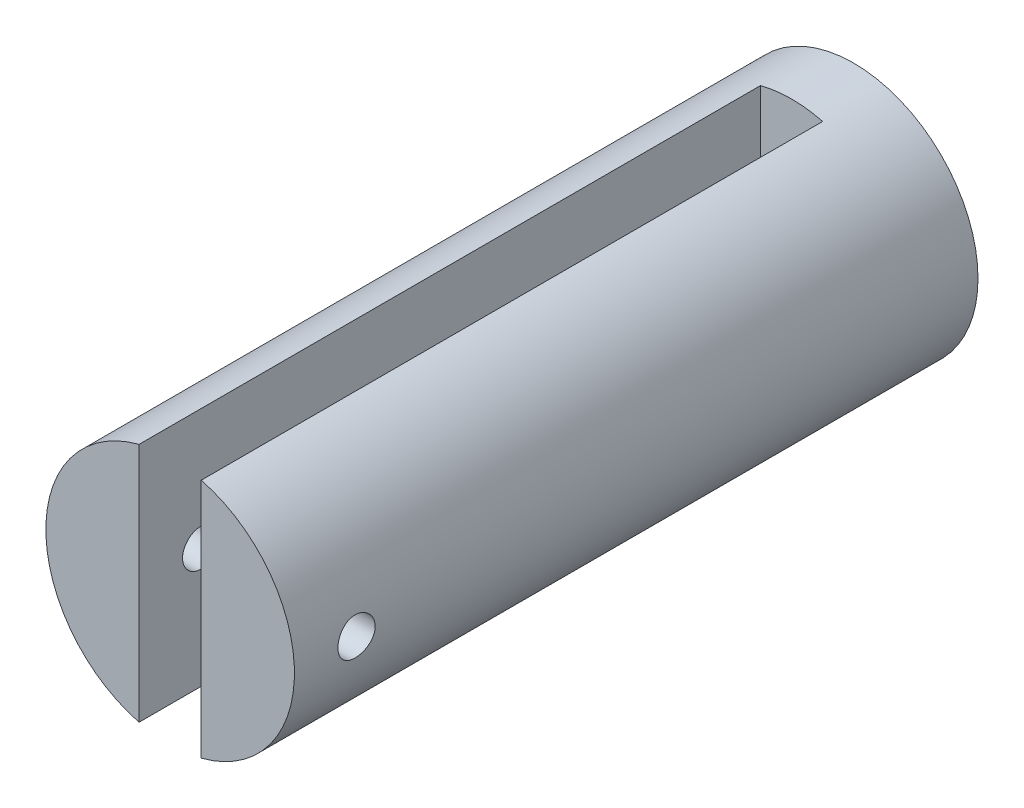
ISO-10303-21;
HEADER;
FILE_DESCRIPTION(('STEP AP214'),'2;1');
FILE_NAME('part.step','',(''),(''),'','','');
FILE_SCHEMA(('AUTOMOTIVE_DESIGN { 1 0 10303 214 1 1 1 1 }'));
ENDSEC;
DATA;
#1=APPLICATION_CONTEXT('core data for automotive mechanical design processes');
#2=APPLICATION_PROTOCOL_DEFINITION('international standard','automotive_design',2000,#1);
#3=PRODUCT_CONTEXT('',#1,'mechanical');
#4=PRODUCT('Part','Part','',(#3));
#5=PRODUCT_RELATED_PRODUCT_CATEGORY('part','',(#4));
#6=PRODUCT_DEFINITION_FORMATION('','',#4);
#7=PRODUCT_DEFINITION_CONTEXT('part definition',#1,'design');
#8=PRODUCT_DEFINITION('design','',#6,#7);
#9=PRODUCT_DEFINITION_SHAPE('','',#8);
#10=(LENGTH_UNIT() NAMED_UNIT(*) SI_UNIT(.MILLI.,.METRE.));
#11=(NAMED_UNIT(*) PLANE_ANGLE_UNIT() SI_UNIT($,.RADIAN.));
#12=(NAMED_UNIT(*) SI_UNIT($,.STERADIAN.) SOLID_ANGLE_UNIT());
#13=UNCERTAINTY_MEASURE_WITH_UNIT(LENGTH_MEASURE(1.E-05),#10,'distance_accuracy_value','');
#14=(GEOMETRIC_REPRESENTATION_CONTEXT(3) GLOBAL_UNCERTAINTY_ASSIGNED_CONTEXT((#13)) GLOBAL_UNIT_ASSIGNED_CONTEXT((#10,
#11,#12)) REPRESENTATION_CONTEXT('',''));
#15=CARTESIAN_POINT('',(0.,0.,0.));
#16=DIRECTION('',(0.,0.,1.));
#17=DIRECTION('',(1.,0.,0.));
#18=AXIS2_PLACEMENT_3D('',#15,#16,#17);
#19=CARTESIAN_POINT('',(0.,0.,5.));
#20=DIRECTION('',(0.,0.,-1.));
#21=DIRECTION('',(-1.,0.,0.));
#22=AXIS2_PLACEMENT_3D('',#19,#20,#21);
#23=CYLINDRICAL_SURFACE('',#22,2.5);
#24=CARTESIAN_POINT('',(0.,0.,0.));
#25=DIRECTION('',(0.,0.,1.));
#26=DIRECTION('',(1.,0.,0.));
#27=AXIS2_PLACEMENT_3D('',#24,#25,#26);
#28=CIRCLE('',#27,2.5);
#29=CARTESIAN_POINT('',(2.5,0.,0.));
#30=VERTEX_POINT('',#29);
#31=EDGE_CURVE('E188',#30,#30,#28,.T.);
#32=ORIENTED_EDGE('',*,*,#31,.F.);
#33=EDGE_LOOP('',(#32));
#34=FACE_BOUND('',#33,.T.);
#35=CARTESIAN_POINT('',(0.,0.,2.5));
#36=DIRECTION('',(0.,0.,1.));
#37=DIRECTION('',(1.,0.,0.));
#38=AXIS2_PLACEMENT_3D('',#35,#36,#37);
#39=CIRCLE('',#38,2.5);
#40=CARTESIAN_POINT('',(2.5,0.,2.5));
#41=VERTEX_POINT('',#40);
#42=EDGE_CURVE('E38',#41,#41,#39,.T.);
#43=ORIENTED_EDGE('',*,*,#42,.T.);
#44=EDGE_LOOP('',(#43));
#45=FACE_BOUND('',#44,.T.);
#46=ADVANCED_FACE('F33',(#34,#45),#23,.F.);
#47=CARTESIAN_POINT('',(0.,0.,5.));
#48=DIRECTION('',(0.,0.,1.));
#49=DIRECTION('',(1.,0.,0.));
#50=AXIS2_PLACEMENT_3D('',#47,#48,#49);
#51=PLANE('',#50);
#52=CARTESIAN_POINT('',(0.,0.,5.));
#53=DIRECTION('',(0.,0.,1.));
#54=DIRECTION('',(1.,0.,0.));
#55=AXIS2_PLACEMENT_3D('',#52,#53,#54);
#56=CIRCLE('',#55,3.75);
#57=CARTESIAN_POINT('',(2.5,2.79508497187474,5.));
#58=VERTEX_POINT('',#57);
#59=CARTESIAN_POINT('',(-2.5,2.79508497187474,5.));
#60=VERTEX_POINT('',#59);
#61=EDGE_CURVE('E110',#58,#60,#56,.T.);
#62=ORIENTED_EDGE('',*,*,#61,.F.);
#63=DIRECTION('',(0.,-1.,0.));
#64=VECTOR('',#63,1.);
#65=CARTESIAN_POINT('',(2.5,-9.68245836551855,5.));
#66=LINE('',#65,#64);
#67=CARTESIAN_POINT('',(2.5,9.68245836551854,5.));
#68=VERTEX_POINT('',#67);
#69=EDGE_CURVE('E123',#68,#58,#66,.T.);
#70=ORIENTED_EDGE('',*,*,#69,.F.);
#71=CARTESIAN_POINT('',(0.,0.,5.));
#72=DIRECTION('',(0.,0.,1.));
#73=DIRECTION('',(1.,0.,0.));
#74=AXIS2_PLACEMENT_3D('',#71,#72,#73);
#75=CIRCLE('',#74,10.);
#76=CARTESIAN_POINT('',(-2.5,9.68245836551854,5.));
#77=VERTEX_POINT('',#76);
#78=EDGE_CURVE('E199',#68,#77,#75,.T.);
#79=ORIENTED_EDGE('',*,*,#78,.T.);
#80=DIRECTION('',(0.,1.,0.));
#81=VECTOR('',#80,1.);
#82=CARTESIAN_POINT('',(-2.5,-9.68245836551854,5.));
#83=LINE('',#82,#81);
#84=EDGE_CURVE('E58',#60,#77,#83,.T.);
#85=ORIENTED_EDGE('',*,*,#84,.F.);
#86=EDGE_LOOP('',(#62,#70,#79,#85));
#87=FACE_BOUND('',#86,.T.);
#88=ADVANCED_FACE('F168',(#87),#51,.T.);
#89=CARTESIAN_POINT('',(0.,0.,5.));
#90=DIRECTION('',(0.,0.,1.));
#91=DIRECTION('',(1.,0.,0.));
#92=AXIS2_PLACEMENT_3D('',#89,#90,#91);
#93=CIRCLE('',#92,3.75);
#94=CARTESIAN_POINT('',(-2.5,-2.79508497187474,5.));
#95=VERTEX_POINT('',#94);
#96=CARTESIAN_POINT('',(2.5,-2.79508497187474,5.));
#97=VERTEX_POINT('',#96);
#98=EDGE_CURVE('E124',#95,#97,#93,.T.);
#99=ORIENTED_EDGE('',*,*,#98,.F.);
#100=CARTESIAN_POINT('',(-2.5,-9.68245836551854,5.));
#101=VERTEX_POINT('',#100);
#102=EDGE_CURVE('E223',#101,#95,#83,.T.);
#103=ORIENTED_EDGE('',*,*,#102,.F.);
#104=CARTESIAN_POINT('',(2.5,-9.68245836551855,5.));
#105=VERTEX_POINT('',#104);
#106=EDGE_CURVE('E191',#101,#105,#75,.T.);
#107=ORIENTED_EDGE('',*,*,#106,.T.);
#108=EDGE_CURVE('E201',#97,#105,#66,.T.);
#109=ORIENTED_EDGE('',*,*,#108,.F.);
#110=EDGE_LOOP('',(#99,#103,#107,#109));
#111=FACE_BOUND('',#110,.T.);
#112=ADVANCED_FACE('F171',(#111),#51,.T.);
#113=CARTESIAN_POINT('',(0.,0.,0.));
#114=DIRECTION('',(0.,0.,1.));
#115=DIRECTION('',(1.,0.,0.));
#116=AXIS2_PLACEMENT_3D('',#113,#114,#115);
#117=PLANE('',#116);
#118=CARTESIAN_POINT('',(0.,0.,0.));
#119=DIRECTION('',(0.,0.,1.));
#120=DIRECTION('',(1.,0.,0.));
#121=AXIS2_PLACEMENT_3D('',#118,#119,#120);
#122=CIRCLE('',#121,10.);
#123=CARTESIAN_POINT('',(10.,0.,0.));
#124=VERTEX_POINT('',#123);
#125=EDGE_CURVE('E185',#124,#124,#122,.T.);
#126=ORIENTED_EDGE('',*,*,#125,.F.);
#127=EDGE_LOOP('',(#126));
#128=FACE_BOUND('',#127,.T.);
#129=ORIENTED_EDGE('',*,*,#31,.T.);
#130=EDGE_LOOP('',(#129));
#131=FACE_BOUND('',#130,.T.);
#132=ADVANCED_FACE('F173',(#128,#131),#117,.F.);
#133=CARTESIAN_POINT('',(0.,0.,5.));
#134=DIRECTION('',(0.,0.,-1.));
#135=DIRECTION('',(-1.,0.,0.));
#136=AXIS2_PLACEMENT_3D('',#133,#134,#135);
#137=CYLINDRICAL_SURFACE('',#136,10.);
#138=CARTESIAN_POINT('',(-10.,0.,51.5));
#139=CARTESIAN_POINT('',(-9.99999865771297,-0.0837515444816427,51.4999965461848));
#140=CARTESIAN_POINT('',(-9.9989368253704,-0.167551685082133,51.4929619991594));
#141=CARTESIAN_POINT('',(-9.99480315973187,-0.332809627994914,51.4650168000173));
#142=CARTESIAN_POINT('',(-9.99172936938473,-0.41426506897423,51.4440926370551));
#143=CARTESIAN_POINT('',(-9.98391721219526,-0.572418086221861,51.3890074950324));
#144=CARTESIAN_POINT('',(-9.97918010370919,-0.649119207826799,51.3548565204941));
#145=CARTESIAN_POINT('',(-9.96856475911724,-0.795690428635255,51.2743116205831));
#146=CARTESIAN_POINT('',(-9.96268668152773,-0.865561474725191,51.2279193955826));
#147=CARTESIAN_POINT('',(-9.95039170991452,-0.997046719562129,51.1238227350601));
#148=CARTESIAN_POINT('',(-9.94397133890331,-1.0585998322255,51.0660415437918));
#149=CARTESIAN_POINT('',(-9.93134261133239,-1.17117490668949,50.9409723111061));
#150=CARTESIAN_POINT('',(-9.92513426698505,-1.22219626272936,50.8736837232215));
#151=CARTESIAN_POINT('',(-9.91359877458726,-1.31249729499943,50.7310993564775));
#152=CARTESIAN_POINT('',(-9.90827611975031,-1.35171787037205,50.6557657530187));
#153=CARTESIAN_POINT('',(-9.89916211306268,-1.41692632171056,50.4994871793546));
#154=CARTESIAN_POINT('',(-9.89537067775449,-1.44291491889163,50.4185425152561));
#155=CARTESIAN_POINT('',(-9.88978256218673,-1.48073198798911,50.2539819581283));
#156=CARTESIAN_POINT('',(-9.8879711574125,-1.49266503640518,50.170390606592));
#157=CARTESIAN_POINT('',(-9.88650348970582,-1.50235624033933,50.0023738340127));
#158=CARTESIAN_POINT('',(-9.88684710303147,-1.50011520973797,49.9179484611375));
#159=CARTESIAN_POINT('',(-9.88963718352409,-1.48160733250788,49.7513989198059));
#160=CARTESIAN_POINT('',(-9.89206618761549,-1.46545695927751,49.6692614735152));
#161=CARTESIAN_POINT('',(-9.89872608126367,-1.41977117403735,49.5088756311285));
#162=CARTESIAN_POINT('',(-9.90295702179379,-1.39023538337812,49.4306273451193));
#163=CARTESIAN_POINT('',(-9.91276335545481,-1.31849603529737,49.2798866287171));
#164=CARTESIAN_POINT('',(-9.91834396766526,-1.27624314283198,49.2074180309076));
#165=CARTESIAN_POINT('',(-9.93021707574548,-1.18030413128955,49.0705554042181));
#166=CARTESIAN_POINT('',(-9.93650961832501,-1.12661726182479,49.0061619057306));
#167=CARTESIAN_POINT('',(-9.9491747305621,-1.00869493078248,48.8866023392603));
#168=CARTESIAN_POINT('',(-9.95554747112815,-0.944359329642007,48.8315350097137));
#169=CARTESIAN_POINT('',(-9.96759647648462,-0.807307089894192,48.7329640654927));
#170=CARTESIAN_POINT('',(-9.9732727382251,-0.734590414588176,48.6894605014561));
#171=CARTESIAN_POINT('',(-9.98329515585393,-0.58275459821369,48.6152469135005));
#172=CARTESIAN_POINT('',(-9.98764051925428,-0.503631677836783,48.5845445081597));
#173=CARTESIAN_POINT('',(-9.99450490557069,-0.341273182487061,48.5368906103146));
#174=CARTESIAN_POINT('',(-9.99702405195467,-0.2580378859526,48.5199381881844));
#175=CARTESIAN_POINT('',(-9.99993581133871,-0.0906695676436446,48.5003967701833));
#176=CARTESIAN_POINT('',(-10.0003485209039,-0.00655273187046889,48.4976720286207));
#177=CARTESIAN_POINT('',(-9.99905561015226,0.160936677662284,48.506303005311));
#178=CARTESIAN_POINT('',(-9.99735005541369,0.244309274381878,48.5176582876681));
#179=CARTESIAN_POINT('',(-9.99202468615333,0.407532387431409,48.5540141001775));
#180=CARTESIAN_POINT('',(-9.98841415207984,0.487397963079839,48.5789484960308));
#181=CARTESIAN_POINT('',(-9.97968235658369,0.641814958643,48.6416849974618));
#182=CARTESIAN_POINT('',(-9.97456102421565,0.716366128795101,48.6794877073336));
#183=CARTESIAN_POINT('',(-9.96332682468686,0.858634979291924,48.7672062245639));
#184=CARTESIAN_POINT('',(-9.95720701626745,0.92629900989157,48.8172081400128));
#185=CARTESIAN_POINT('',(-9.94467863012165,1.05232367317771,48.9277858116287));
#186=CARTESIAN_POINT('',(-9.93827003562867,1.11068376479341,48.9883621823247));
#187=CARTESIAN_POINT('',(-9.92582264304494,1.21693784957196,49.1189735331765));
#188=CARTESIAN_POINT('',(-9.91978736017588,1.26474084747421,49.1890829251948));
#189=CARTESIAN_POINT('',(-9.90883219104903,1.34789129270584,49.3364160405118));
#190=CARTESIAN_POINT('',(-9.90391227465629,1.38323907656436,49.4136395715215));
#191=CARTESIAN_POINT('',(-9.89577033008645,1.44033467323944,49.5727375336231));
#192=CARTESIAN_POINT('',(-9.89254233006438,1.46213037141636,49.6545944609712));
#193=CARTESIAN_POINT('',(-9.88813382297802,1.49165549501587,49.8208590154351));
#194=CARTESIAN_POINT('',(-9.88695317451771,1.49938589183067,49.9052664659947));
#195=CARTESIAN_POINT('',(-9.88677832610841,1.5005378666944,50.0733290633158));
#196=CARTESIAN_POINT('',(-9.88776226333502,1.49410252167313,50.1569832417569));
#197=CARTESIAN_POINT('',(-9.89175820611174,1.46741229544379,50.3220052633235));
#198=CARTESIAN_POINT('',(-9.89477020841118,1.44715743638627,50.4033731101134));
#199=CARTESIAN_POINT('',(-9.90247526112297,1.39345373518666,50.5614730822343));
#200=CARTESIAN_POINT('',(-9.90716703716075,1.36001489324314,50.6382086704334));
#201=CARTESIAN_POINT('',(-9.91770454557702,1.28090667642309,50.7850036338024));
#202=CARTESIAN_POINT('',(-9.92355031702723,1.23523688741502,50.8550627828036));
#203=CARTESIAN_POINT('',(-9.93580743364938,1.13244337659164,50.9872430579752));
#204=CARTESIAN_POINT('',(-9.94222367881967,1.07521369039806,51.0492813332471));
#205=CARTESIAN_POINT('',(-9.95485788826637,0.951148841082835,51.1629245547878));
#206=CARTESIAN_POINT('',(-9.96107580610759,0.884311448350943,51.2145270725762));
#207=CARTESIAN_POINT('',(-9.9726518579052,0.742495707543724,51.3060876766074));
#208=CARTESIAN_POINT('',(-9.9780050712882,0.667474576764763,51.3459801092148));
#209=CARTESIAN_POINT('',(-9.9872002880296,0.511751870248722,51.412538516758));
#210=CARTESIAN_POINT('',(-9.99104385565757,0.431056277096709,51.4392181900537));
#211=CARTESIAN_POINT('',(-9.99590939261506,0.291665727889334,51.4725413427101));
#212=CARTESIAN_POINT('',(-9.99743549179557,0.233831133495283,51.4828226015388));
#213=CARTESIAN_POINT('',(-9.99948125947896,0.117338971600127,51.4965530977126));
#214=CARTESIAN_POINT('',(-10.0000009404877,0.0586814143344182,51.5000024199526));
#215=CARTESIAN_POINT('',(-10.,0.,51.5));
#216=B_SPLINE_CURVE_WITH_KNOTS('',3,(#138,#139,#140,#141,#142,#143,#144,#145,#146,#147,#148,
#149,#150,#151,#152,#153,#154,#155,#156,#157,#158,#159,#160,#161,#162,#163,#164,#165,#166,#167,
#168,#169,#170,#171,#172,#173,#174,#175,#176,#177,#178,#179,#180,#181,#182,#183,#184,#185,#186,
#187,#188,#189,#190,#191,#192,#193,#194,#195,#196,#197,#198,#199,#200,#201,#202,#203,#204,#205,
#206,#207,#208,#209,#210,#211,#212,#213,#214,#215),.UNSPECIFIED.,.T.,.F.,(4,2,2,2,2,2,2,2,2,2,2,
2,2,2,2,2,2,2,2,2,2,2,2,2,2,2,2,2,2,2,2,2,2,2,2,2,2,2,4),(0.,0.251040205031665,
0.502324962929151,0.753420023583239,1.0044802241976,1.25729416136844,1.5101226357258,
1.76419702395375,2.01825756225506,2.27041564605924,2.52255925098983,2.77261177195747,
3.02267136690362,3.27371383476159,3.52477278308534,3.77834291255409,4.03191415238668,
4.28563608984875,4.53934087193402,4.79062058544256,5.04189251991156,5.29195148965949,
5.54202220376275,5.79391188036909,6.04581620028631,6.29981366584673,6.55380426808834,
6.8068922345717,7.05996272137179,7.31048888261066,7.56101464229565,7.81135073984148,
8.06169531466881,8.31444829965723,8.56726003468735,8.82146323384735,9.07540233261443,
9.2512985197881,9.42719252123293),.UNSPECIFIED.);
#217=CARTESIAN_POINT('',(-10.,0.,51.5));
#218=VERTEX_POINT('',#217);
#219=EDGE_CURVE('E140',#218,#218,#216,.T.);
#220=ORIENTED_EDGE('',*,*,#219,.T.);
#221=EDGE_LOOP('',(#220));
#222=FACE_BOUND('',#221,.T.);
#223=CARTESIAN_POINT('',(10.,0.,51.5));
#224=CARTESIAN_POINT('',(9.99999865771297,0.0837515444816427,51.4999965461848));
#225=CARTESIAN_POINT('',(9.9989368253704,0.167551685082133,51.4929619991594));
#226=CARTESIAN_POINT('',(9.99480315973187,0.332809627994914,51.4650168000173));
#227=CARTESIAN_POINT('',(9.99172936938473,0.41426506897423,51.4440926370551));
#228=CARTESIAN_POINT('',(9.98391721219526,0.572418086221861,51.3890074950324));
#229=CARTESIAN_POINT('',(9.97918010370919,0.649119207826799,51.3548565204941));
#230=CARTESIAN_POINT('',(9.96856475911724,0.795690428635255,51.2743116205831));
#231=CARTESIAN_POINT('',(9.96268668152773,0.865561474725191,51.2279193955826));
#232=CARTESIAN_POINT('',(9.95039170991452,0.997046719562129,51.1238227350601));
#233=CARTESIAN_POINT('',(9.94397133890331,1.0585998322255,51.0660415437918));
#234=CARTESIAN_POINT('',(9.93134261133239,1.17117490668949,50.9409723111061));
#235=CARTESIAN_POINT('',(9.92513426698505,1.22219626272936,50.8736837232215));
#236=CARTESIAN_POINT('',(9.91359877458726,1.31249729499943,50.7310993564775));
#237=CARTESIAN_POINT('',(9.90827611975031,1.35171787037205,50.6557657530187));
#238=CARTESIAN_POINT('',(9.89916211306268,1.41692632171056,50.4994871793546));
#239=CARTESIAN_POINT('',(9.89537067775449,1.44291491889163,50.4185425152561));
#240=CARTESIAN_POINT('',(9.88978256218673,1.48073198798911,50.2539819581283));
#241=CARTESIAN_POINT('',(9.8879711574125,1.49266503640518,50.170390606592));
#242=CARTESIAN_POINT('',(9.88650348970582,1.50235624033933,50.0023738340127));
#243=CARTESIAN_POINT('',(9.88684710303147,1.50011520973797,49.9179484611375));
#244=CARTESIAN_POINT('',(9.88963718352409,1.48160733250788,49.7513989198059));
#245=CARTESIAN_POINT('',(9.89206618761549,1.46545695927751,49.6692614735152));
#246=CARTESIAN_POINT('',(9.89872608126367,1.41977117403735,49.5088756311285));
#247=CARTESIAN_POINT('',(9.90295702179379,1.39023538337812,49.4306273451193));
#248=CARTESIAN_POINT('',(9.91276335545481,1.31849603529737,49.2798866287171));
#249=CARTESIAN_POINT('',(9.91834396766526,1.27624314283198,49.2074180309076));
#250=CARTESIAN_POINT('',(9.93021707574548,1.18030413128955,49.0705554042181));
#251=CARTESIAN_POINT('',(9.93650961832501,1.12661726182479,49.0061619057306));
#252=CARTESIAN_POINT('',(9.9491747305621,1.00869493078248,48.8866023392603));
#253=CARTESIAN_POINT('',(9.95554747112815,0.944359329642007,48.8315350097137));
#254=CARTESIAN_POINT('',(9.96759647648462,0.807307089894192,48.7329640654927));
#255=CARTESIAN_POINT('',(9.9732727382251,0.734590414588176,48.6894605014561));
#256=CARTESIAN_POINT('',(9.98329515585393,0.58275459821369,48.6152469135005));
#257=CARTESIAN_POINT('',(9.98764051925428,0.503631677836783,48.5845445081597));
#258=CARTESIAN_POINT('',(9.99450490557069,0.341273182487061,48.5368906103146));
#259=CARTESIAN_POINT('',(9.99702405195467,0.2580378859526,48.5199381881844));
#260=CARTESIAN_POINT('',(9.99993581133871,0.0906695676436446,48.5003967701833));
#261=CARTESIAN_POINT('',(10.0003485209039,0.00655273187046889,48.4976720286207));
#262=CARTESIAN_POINT('',(9.99905561015226,-0.160936677662284,48.506303005311));
#263=CARTESIAN_POINT('',(9.99735005541369,-0.244309274381878,48.5176582876681));
#264=CARTESIAN_POINT('',(9.99202468615333,-0.407532387431409,48.5540141001775));
#265=CARTESIAN_POINT('',(9.98841415207984,-0.487397963079839,48.5789484960308));
#266=CARTESIAN_POINT('',(9.97968235658369,-0.641814958643,48.6416849974618));
#267=CARTESIAN_POINT('',(9.97456102421565,-0.716366128795101,48.6794877073336));
#268=CARTESIAN_POINT('',(9.96332682468686,-0.858634979291924,48.7672062245639));
#269=CARTESIAN_POINT('',(9.95720701626745,-0.92629900989157,48.8172081400128));
#270=CARTESIAN_POINT('',(9.94467863012165,-1.05232367317771,48.9277858116287));
#271=CARTESIAN_POINT('',(9.93827003562867,-1.11068376479341,48.9883621823247));
#272=CARTESIAN_POINT('',(9.92582264304494,-1.21693784957196,49.1189735331765));
#273=CARTESIAN_POINT('',(9.91978736017588,-1.26474084747421,49.1890829251948));
#274=CARTESIAN_POINT('',(9.90883219104903,-1.34789129270584,49.3364160405118));
#275=CARTESIAN_POINT('',(9.90391227465629,-1.38323907656436,49.4136395715215));
#276=CARTESIAN_POINT('',(9.89577033008645,-1.44033467323944,49.5727375336231));
#277=CARTESIAN_POINT('',(9.89254233006438,-1.46213037141636,49.6545944609712));
#278=CARTESIAN_POINT('',(9.88813382297802,-1.49165549501587,49.8208590154351));
#279=CARTESIAN_POINT('',(9.88695317451771,-1.49938589183067,49.9052664659947));
#280=CARTESIAN_POINT('',(9.88677832610841,-1.5005378666944,50.0733290633158));
#281=CARTESIAN_POINT('',(9.88776226333502,-1.49410252167313,50.1569832417569));
#282=CARTESIAN_POINT('',(9.89175820611174,-1.46741229544379,50.3220052633235));
#283=CARTESIAN_POINT('',(9.89477020841118,-1.44715743638627,50.4033731101134));
#284=CARTESIAN_POINT('',(9.90247526112297,-1.39345373518666,50.5614730822343));
#285=CARTESIAN_POINT('',(9.90716703716075,-1.36001489324314,50.6382086704334));
#286=CARTESIAN_POINT('',(9.91770454557702,-1.28090667642309,50.7850036338024));
#287=CARTESIAN_POINT('',(9.92355031702723,-1.23523688741502,50.8550627828036));
#288=CARTESIAN_POINT('',(9.93580743364938,-1.13244337659164,50.9872430579752));
#289=CARTESIAN_POINT('',(9.94222367881967,-1.07521369039806,51.0492813332471));
#290=CARTESIAN_POINT('',(9.95485788826637,-0.951148841082835,51.1629245547878));
#291=CARTESIAN_POINT('',(9.96107580610759,-0.884311448350943,51.2145270725762));
#292=CARTESIAN_POINT('',(9.9726518579052,-0.742495707543724,51.3060876766074));
#293=CARTESIAN_POINT('',(9.9780050712882,-0.667474576764763,51.3459801092148));
#294=CARTESIAN_POINT('',(9.9872002880296,-0.511751870248722,51.412538516758));
#295=CARTESIAN_POINT('',(9.99104385565757,-0.431056277096709,51.4392181900537));
#296=CARTESIAN_POINT('',(9.99590939261506,-0.291665727889334,51.4725413427101));
#297=CARTESIAN_POINT('',(9.99743549179557,-0.233831133495283,51.4828226015388));
#298=CARTESIAN_POINT('',(9.99948125947896,-0.117338971600127,51.4965530977126));
#299=CARTESIAN_POINT('',(10.0000009404877,-0.0586814143344182,51.5000024199526));
#300=CARTESIAN_POINT('',(10.,0.,51.5));
#301=B_SPLINE_CURVE_WITH_KNOTS('',3,(#223,#224,#225,#226,#227,#228,#229,#230,#231,#232,#233,
#234,#235,#236,#237,#238,#239,#240,#241,#242,#243,#244,#245,#246,#247,#248,#249,#250,#251,#252,
#253,#254,#255,#256,#257,#258,#259,#260,#261,#262,#263,#264,#265,#266,#267,#268,#269,#270,#271,
#272,#273,#274,#275,#276,#277,#278,#279,#280,#281,#282,#283,#284,#285,#286,#287,#288,#289,#290,
#291,#292,#293,#294,#295,#296,#297,#298,#299,#300),.UNSPECIFIED.,.T.,.F.,(4,2,2,2,2,2,2,2,2,2,2,
2,2,2,2,2,2,2,2,2,2,2,2,2,2,2,2,2,2,2,2,2,2,2,2,2,2,2,4),(0.,0.251040205031665,
0.502324962929151,0.753420023583239,1.0044802241976,1.25729416136844,1.5101226357258,
1.76419702395375,2.01825756225506,2.27041564605924,2.52255925098983,2.77261177195747,
3.02267136690362,3.27371383476159,3.52477278308534,3.77834291255409,4.03191415238668,
4.28563608984875,4.53934087193402,4.79062058544256,5.04189251991156,5.29195148965949,
5.54202220376275,5.79391188036909,6.04581620028631,6.29981366584673,6.55380426808834,
6.8068922345717,7.05996272137179,7.31048888261066,7.56101464229565,7.81135073984148,
8.06169531466881,8.31444829965723,8.56726003468735,8.82146323384735,9.07540233261443,
9.2512985197881,9.42719252123293),.UNSPECIFIED.);
#302=CARTESIAN_POINT('',(10.,0.,51.5));
#303=VERTEX_POINT('',#302);
#304=EDGE_CURVE('E133',#303,#303,#301,.T.);
#305=ORIENTED_EDGE('',*,*,#304,.T.);
#306=EDGE_LOOP('',(#305));
#307=FACE_BOUND('',#306,.T.);
#308=ORIENTED_EDGE('',*,*,#78,.F.);
#309=DIRECTION('',(0.,0.,-1.));
#310=VECTOR('',#309,1.);
#311=CARTESIAN_POINT('',(2.5,9.68245836551855,55.));
#312=LINE('',#311,#310);
#313=CARTESIAN_POINT('',(2.5,9.68245836551855,55.));
#314=VERTEX_POINT('',#313);
#315=EDGE_CURVE('E189',#314,#68,#312,.T.);
#316=ORIENTED_EDGE('',*,*,#315,.F.);
#317=CARTESIAN_POINT('',(0.,0.,55.));
#318=DIRECTION('',(0.,0.,1.));
#319=DIRECTION('',(1.,0.,0.));
#320=AXIS2_PLACEMENT_3D('',#317,#318,#319);
#321=CIRCLE('',#320,10.);
#322=CARTESIAN_POINT('',(2.5,-9.68245836551855,55.));
#323=VERTEX_POINT('',#322);
#324=EDGE_CURVE('E231',#323,#314,#321,.T.);
#325=ORIENTED_EDGE('',*,*,#324,.F.);
#326=DIRECTION('',(0.,0.,-1.));
#327=VECTOR('',#326,1.);
#328=CARTESIAN_POINT('',(2.5,-9.68245836551855,55.));
#329=LINE('',#328,#327);
#330=EDGE_CURVE('E193',#323,#105,#329,.T.);
#331=ORIENTED_EDGE('',*,*,#330,.T.);
#332=ORIENTED_EDGE('',*,*,#106,.F.);
#333=DIRECTION('',(0.,0.,-1.));
#334=VECTOR('',#333,1.);
#335=CARTESIAN_POINT('',(-2.5,-9.68245836551854,55.));
#336=LINE('',#335,#334);
#337=CARTESIAN_POINT('',(-2.5,-9.68245836551854,55.));
#338=VERTEX_POINT('',#337);
#339=EDGE_CURVE('E235',#338,#101,#336,.T.);
#340=ORIENTED_EDGE('',*,*,#339,.F.);
#341=CARTESIAN_POINT('',(0.,0.,55.));
#342=DIRECTION('',(0.,0.,1.));
#343=DIRECTION('',(1.,0.,0.));
#344=AXIS2_PLACEMENT_3D('',#341,#342,#343);
#345=CIRCLE('',#344,10.);
#346=CARTESIAN_POINT('',(-2.5,9.68245836551854,55.));
#347=VERTEX_POINT('',#346);
#348=EDGE_CURVE('E242',#347,#338,#345,.T.);
#349=ORIENTED_EDGE('',*,*,#348,.F.);
#350=DIRECTION('',(0.,0.,-1.));
#351=VECTOR('',#350,1.);
#352=CARTESIAN_POINT('',(-2.5,9.68245836551854,55.));
#353=LINE('',#352,#351);
#354=EDGE_CURVE('E237',#347,#77,#353,.T.);
#355=ORIENTED_EDGE('',*,*,#354,.T.);
#356=EDGE_LOOP('',(#308,#316,#325,#331,#332,#340,#349,#355));
#357=FACE_BOUND('',#356,.T.);
#358=ORIENTED_EDGE('',*,*,#125,.T.);
#359=EDGE_LOOP('',(#358));
#360=FACE_BOUND('',#359,.T.);
#361=ADVANCED_FACE('F35',(#222,#307,#357,#360),#137,.T.);
#362=CARTESIAN_POINT('',(2.5,-9.68245836551855,55.));
#363=DIRECTION('',(1.,0.,0.));
#364=DIRECTION('',(0.,0.,-1.));
#365=AXIS2_PLACEMENT_3D('',#362,#363,#364);
#366=PLANE('',#365);
#367=ORIENTED_EDGE('',*,*,#69,.T.);
#368=DIRECTION('',(0.,0.,1.));
#369=VECTOR('',#368,1.);
#370=CARTESIAN_POINT('',(2.5,2.79508497187474,2.5));
#371=LINE('',#370,#369);
#372=CARTESIAN_POINT('',(2.5,2.79508497187474,45.));
#373=VERTEX_POINT('',#372);
#374=EDGE_CURVE('E115',#58,#373,#371,.T.);
#375=ORIENTED_EDGE('',*,*,#374,.T.);
#376=DIRECTION('',(0.,-1.,0.));
#377=VECTOR('',#376,1.);
#378=CARTESIAN_POINT('',(2.5,-9.68245836551855,45.));
#379=LINE('',#378,#377);
#380=CARTESIAN_POINT('',(2.5,-2.79508497187474,45.));
#381=VERTEX_POINT('',#380);
#382=EDGE_CURVE('E103',#373,#381,#379,.T.);
#383=ORIENTED_EDGE('',*,*,#382,.T.);
#384=DIRECTION('',(0.,0.,1.));
#385=VECTOR('',#384,1.);
#386=CARTESIAN_POINT('',(2.5,-2.79508497187474,2.5));
#387=LINE('',#386,#385);
#388=EDGE_CURVE('E117',#381,#97,#387,.F.);
#389=ORIENTED_EDGE('',*,*,#388,.T.);
#390=ORIENTED_EDGE('',*,*,#108,.T.);
#391=ORIENTED_EDGE('',*,*,#330,.F.);
#392=DIRECTION('',(0.,-1.,0.));
#393=VECTOR('',#392,1.);
#394=CARTESIAN_POINT('',(2.5,-9.68245836551855,55.));
#395=LINE('',#394,#393);
#396=EDGE_CURVE('E232',#314,#323,#395,.T.);
#397=ORIENTED_EDGE('',*,*,#396,.F.);
#398=ORIENTED_EDGE('',*,*,#315,.T.);
#399=EDGE_LOOP('',(#367,#375,#383,#389,#390,#391,#397,#398));
#400=FACE_BOUND('',#399,.T.);
#401=CARTESIAN_POINT('',(2.5,0.,50.));
#402=DIRECTION('',(1.,0.,0.));
#403=DIRECTION('',(0.,0.,-1.));
#404=AXIS2_PLACEMENT_3D('',#401,#402,#403);
#405=CIRCLE('',#404,1.5);
#406=CARTESIAN_POINT('',(2.5,0.,48.5));
#407=VERTEX_POINT('',#406);
#408=EDGE_CURVE('E130',#407,#407,#405,.T.);
#409=ORIENTED_EDGE('',*,*,#408,.T.);
#410=EDGE_LOOP('',(#409));
#411=FACE_BOUND('',#410,.T.);
#412=ADVANCED_FACE('F120',(#400,#411),#366,.F.);
#413=CARTESIAN_POINT('',(0.,0.,55.));
#414=DIRECTION('',(0.,0.,1.));
#415=DIRECTION('',(1.,0.,0.));
#416=AXIS2_PLACEMENT_3D('',#413,#414,#415);
#417=PLANE('',#416);
#418=ORIENTED_EDGE('',*,*,#324,.T.);
#419=ORIENTED_EDGE('',*,*,#396,.T.);
#420=EDGE_LOOP('',(#418,#419));
#421=FACE_BOUND('',#420,.T.);
#422=ADVANCED_FACE('F160',(#421),#417,.T.);
#423=CARTESIAN_POINT('',(-2.5,-9.68245836551854,55.));
#424=DIRECTION('',(-1.,0.,0.));
#425=DIRECTION('',(0.,0.,1.));
#426=AXIS2_PLACEMENT_3D('',#423,#424,#425);
#427=PLANE('',#426);
#428=ORIENTED_EDGE('',*,*,#102,.T.);
#429=DIRECTION('',(0.,0.,1.));
#430=VECTOR('',#429,1.);
#431=CARTESIAN_POINT('',(-2.5,-2.79508497187474,2.5));
#432=LINE('',#431,#430);
#433=CARTESIAN_POINT('',(-2.5,-2.79508497187474,45.));
#434=VERTEX_POINT('',#433);
#435=EDGE_CURVE('E11',#95,#434,#432,.T.);
#436=ORIENTED_EDGE('',*,*,#435,.T.);
#437=DIRECTION('',(0.,1.,0.));
#438=VECTOR('',#437,1.);
#439=CARTESIAN_POINT('',(-2.5,-9.68245836551854,45.));
#440=LINE('',#439,#438);
#441=CARTESIAN_POINT('',(-2.5,2.79508497187474,45.));
#442=VERTEX_POINT('',#441);
#443=EDGE_CURVE('E213',#434,#442,#440,.T.);
#444=ORIENTED_EDGE('',*,*,#443,.T.);
#445=DIRECTION('',(0.,0.,1.));
#446=VECTOR('',#445,1.);
#447=CARTESIAN_POINT('',(-2.5,2.79508497187474,2.5));
#448=LINE('',#447,#446);
#449=EDGE_CURVE('E43',#442,#60,#448,.F.);
#450=ORIENTED_EDGE('',*,*,#449,.T.);
#451=ORIENTED_EDGE('',*,*,#84,.T.);
#452=ORIENTED_EDGE('',*,*,#354,.F.);
#453=DIRECTION('',(0.,1.,0.));
#454=VECTOR('',#453,1.);
#455=CARTESIAN_POINT('',(-2.5,-9.68245836551854,55.));
#456=LINE('',#455,#454);
#457=EDGE_CURVE('E240',#338,#347,#456,.T.);
#458=ORIENTED_EDGE('',*,*,#457,.F.);
#459=ORIENTED_EDGE('',*,*,#339,.T.);
#460=EDGE_LOOP('',(#428,#436,#444,#450,#451,#452,#458,#459));
#461=FACE_BOUND('',#460,.T.);
#462=CARTESIAN_POINT('',(-2.5,0.,50.));
#463=DIRECTION('',(-1.,0.,0.));
#464=DIRECTION('',(0.,0.,1.));
#465=AXIS2_PLACEMENT_3D('',#462,#463,#464);
#466=CIRCLE('',#465,1.5);
#467=CARTESIAN_POINT('',(-2.5,0.,51.5));
#468=VERTEX_POINT('',#467);
#469=EDGE_CURVE('E134',#468,#468,#466,.T.);
#470=ORIENTED_EDGE('',*,*,#469,.T.);
#471=EDGE_LOOP('',(#470));
#472=FACE_BOUND('',#471,.T.);
#473=ADVANCED_FACE('F156',(#461,#472),#427,.F.);
#474=CARTESIAN_POINT('',(0.,0.,55.));
#475=DIRECTION('',(0.,0.,1.));
#476=DIRECTION('',(1.,0.,0.));
#477=AXIS2_PLACEMENT_3D('',#474,#475,#476);
#478=PLANE('',#477);
#479=ORIENTED_EDGE('',*,*,#348,.T.);
#480=ORIENTED_EDGE('',*,*,#457,.T.);
#481=EDGE_LOOP('',(#479,#480));
#482=FACE_BOUND('',#481,.T.);
#483=ADVANCED_FACE('F150',(#482),#478,.T.);
#484=CARTESIAN_POINT('',(22.5,0.,50.));
#485=DIRECTION('',(-1.,0.,0.));
#486=DIRECTION('',(0.,0.,1.));
#487=AXIS2_PLACEMENT_3D('',#484,#485,#486);
#488=CYLINDRICAL_SURFACE('',#487,1.5);
#489=ORIENTED_EDGE('',*,*,#469,.F.);
#490=EDGE_LOOP('',(#489));
#491=FACE_BOUND('',#490,.T.);
#492=ORIENTED_EDGE('',*,*,#219,.F.);
#493=EDGE_LOOP('',(#492));
#494=FACE_BOUND('',#493,.T.);
#495=ADVANCED_FACE('F144',(#491,#494),#488,.F.);
#496=ORIENTED_EDGE('',*,*,#408,.F.);
#497=EDGE_LOOP('',(#496));
#498=FACE_BOUND('',#497,.T.);
#499=ORIENTED_EDGE('',*,*,#304,.F.);
#500=EDGE_LOOP('',(#499));
#501=FACE_BOUND('',#500,.T.);
#502=ADVANCED_FACE('F149',(#498,#501),#488,.F.);
#503=CARTESIAN_POINT('',(0.,0.,2.5));
#504=DIRECTION('',(0.,0.,1.));
#505=DIRECTION('',(1.,0.,0.));
#506=AXIS2_PLACEMENT_3D('',#503,#504,#505);
#507=CYLINDRICAL_SURFACE('',#506,3.75);
#508=CARTESIAN_POINT('',(0.,0.,2.5));
#509=DIRECTION('',(0.,0.,1.));
#510=DIRECTION('',(1.,0.,0.));
#511=AXIS2_PLACEMENT_3D('',#508,#509,#510);
#512=CIRCLE('',#511,3.75);
#513=CARTESIAN_POINT('',(3.75,0.,2.5));
#514=VERTEX_POINT('',#513);
#515=EDGE_CURVE('E111',#514,#514,#512,.T.);
#516=ORIENTED_EDGE('',*,*,#515,.F.);
#517=EDGE_LOOP('',(#516));
#518=FACE_BOUND('',#517,.T.);
#519=CARTESIAN_POINT('',(0.,0.,45.));
#520=DIRECTION('',(0.,0.,1.));
#521=DIRECTION('',(1.,0.,0.));
#522=AXIS2_PLACEMENT_3D('',#519,#520,#521);
#523=CIRCLE('',#522,3.75);
#524=EDGE_CURVE('E106',#381,#373,#523,.T.);
#525=ORIENTED_EDGE('',*,*,#524,.T.);
#526=ORIENTED_EDGE('',*,*,#374,.F.);
#527=ORIENTED_EDGE('',*,*,#61,.T.);
#528=ORIENTED_EDGE('',*,*,#449,.F.);
#529=EDGE_CURVE('E50',#442,#434,#523,.T.);
#530=ORIENTED_EDGE('',*,*,#529,.T.);
#531=ORIENTED_EDGE('',*,*,#435,.F.);
#532=ORIENTED_EDGE('',*,*,#98,.T.);
#533=ORIENTED_EDGE('',*,*,#388,.F.);
#534=EDGE_LOOP('',(#525,#526,#527,#528,#530,#531,#532,#533));
#535=FACE_BOUND('',#534,.T.);
#536=ADVANCED_FACE('F114',(#518,#535),#507,.F.);
#537=CARTESIAN_POINT('',(0.,0.,45.));
#538=DIRECTION('',(0.,0.,1.));
#539=DIRECTION('',(1.,0.,0.));
#540=AXIS2_PLACEMENT_3D('',#537,#538,#539);
#541=PLANE('',#540);
#542=ORIENTED_EDGE('',*,*,#524,.F.);
#543=ORIENTED_EDGE('',*,*,#382,.F.);
#544=EDGE_LOOP('',(#542,#543));
#545=FACE_BOUND('',#544,.T.);
#546=ADVANCED_FACE('F105',(#545),#541,.F.);
#547=ORIENTED_EDGE('',*,*,#529,.F.);
#548=ORIENTED_EDGE('',*,*,#443,.F.);
#549=EDGE_LOOP('',(#547,#548));
#550=FACE_BOUND('',#549,.T.);
#551=ADVANCED_FACE('F248',(#550),#541,.F.);
#552=CARTESIAN_POINT('',(0.,0.,2.5));
#553=DIRECTION('',(0.,0.,1.));
#554=DIRECTION('',(1.,0.,0.));
#555=AXIS2_PLACEMENT_3D('',#552,#553,#554);
#556=PLANE('',#555);
#557=ORIENTED_EDGE('',*,*,#42,.F.);
#558=EDGE_LOOP('',(#557));
#559=FACE_BOUND('',#558,.T.);
#560=ORIENTED_EDGE('',*,*,#515,.T.);
#561=EDGE_LOOP('',(#560));
#562=FACE_BOUND('',#561,.T.);
#563=ADVANCED_FACE('F253',(#559,#562),#556,.T.);
#564=CLOSED_SHELL('',(#46,#88,#112,#132,#361,#412,#422,#473,#483,#495,#502,#536,#546,#551,#563));
#565=MANIFOLD_SOLID_BREP('B2',#564);
#566=ADVANCED_BREP_SHAPE_REPRESENTATION('',(#18,#565),#14);
#567=SHAPE_DEFINITION_REPRESENTATION(#9,#566);
ENDSEC;
END-ISO-10303-21;
